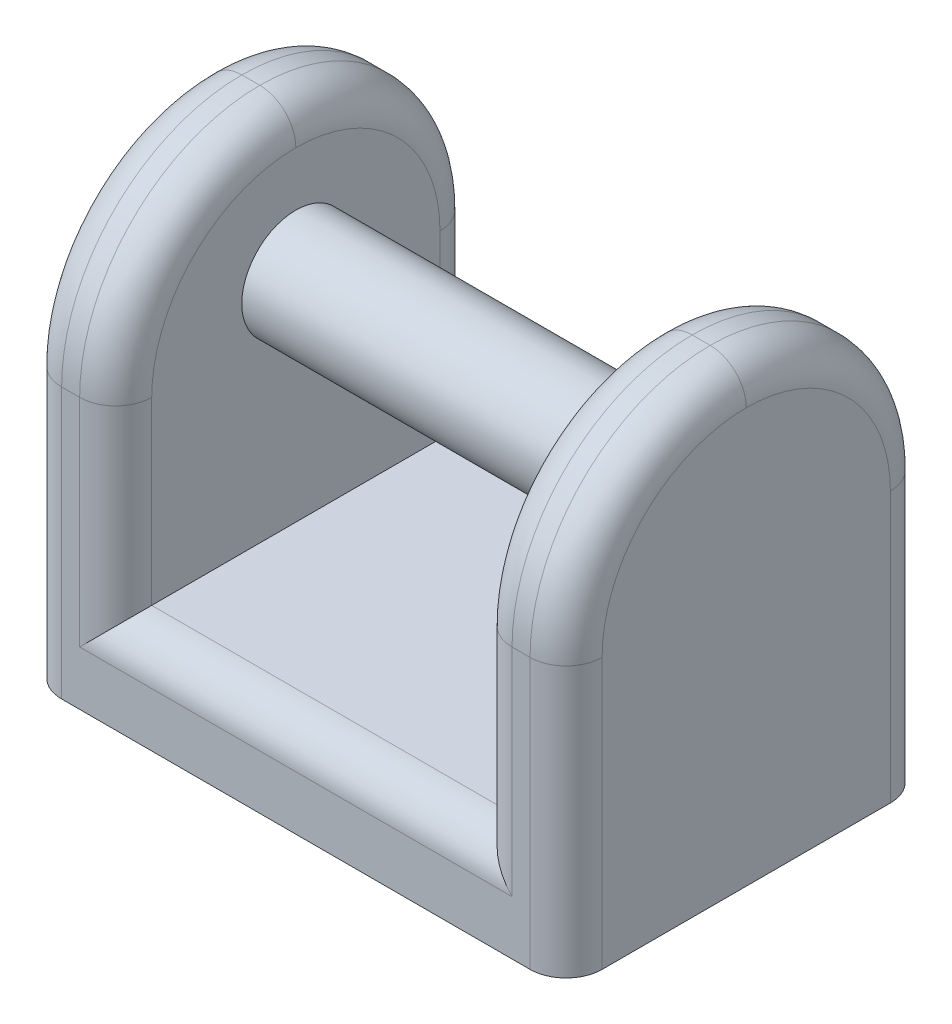
ISO-10303-21;
HEADER;
FILE_DESCRIPTION(('STEP AP214'),'2;1');
FILE_NAME('part.step','',(''),(''),'','','');
FILE_SCHEMA(('AUTOMOTIVE_DESIGN { 1 0 10303 214 1 1 1 1 }'));
ENDSEC;
DATA;
#1=APPLICATION_CONTEXT('core data for automotive mechanical design processes');
#2=APPLICATION_PROTOCOL_DEFINITION('international standard','automotive_design',2000,#1);
#3=PRODUCT_CONTEXT('',#1,'mechanical');
#4=PRODUCT('Part','Part','',(#3));
#5=PRODUCT_RELATED_PRODUCT_CATEGORY('part','',(#4));
#6=PRODUCT_DEFINITION_FORMATION('','',#4);
#7=PRODUCT_DEFINITION_CONTEXT('part definition',#1,'design');
#8=PRODUCT_DEFINITION('design','',#6,#7);
#9=PRODUCT_DEFINITION_SHAPE('','',#8);
#10=(LENGTH_UNIT() NAMED_UNIT(*) SI_UNIT(.MILLI.,.METRE.));
#11=(NAMED_UNIT(*) PLANE_ANGLE_UNIT() SI_UNIT($,.RADIAN.));
#12=(NAMED_UNIT(*) SI_UNIT($,.STERADIAN.) SOLID_ANGLE_UNIT());
#13=UNCERTAINTY_MEASURE_WITH_UNIT(LENGTH_MEASURE(1.E-05),#10,'distance_accuracy_value','');
#14=(GEOMETRIC_REPRESENTATION_CONTEXT(3) GLOBAL_UNCERTAINTY_ASSIGNED_CONTEXT((#13)) GLOBAL_UNIT_ASSIGNED_CONTEXT((#10,
#11,#12)) REPRESENTATION_CONTEXT('',''));
#15=CARTESIAN_POINT('',(0.,0.,0.));
#16=DIRECTION('',(0.,0.,1.));
#17=DIRECTION('',(1.,0.,0.));
#18=AXIS2_PLACEMENT_3D('',#15,#16,#17);
#19=CARTESIAN_POINT('',(75.,50.,50.));
#20=DIRECTION('',(1.,0.,0.));
#21=DIRECTION('',(0.,1.,0.));
#22=AXIS2_PLACEMENT_3D('',#19,#20,#21);
#23=PLANE('',#22);
#24=CARTESIAN_POINT('',(75.,25.,25.));
#25=DIRECTION('',(1.,0.,0.));
#26=DIRECTION('',(0.,1.,0.));
#27=AXIS2_PLACEMENT_3D('',#24,#25,#26);
#28=CIRCLE('',#27,20.);
#29=CARTESIAN_POINT('',(75.,45.,25.));
#30=VERTEX_POINT('',#29);
#31=CARTESIAN_POINT('',(75.,25.,45.));
#32=VERTEX_POINT('',#31);
#33=EDGE_CURVE('E284',#30,#32,#28,.T.);
#34=ORIENTED_EDGE('',*,*,#33,.T.);
#35=DIRECTION('',(0.,-1.,0.));
#36=VECTOR('',#35,1.);
#37=CARTESIAN_POINT('',(75.,-12.5,45.));
#38=LINE('',#37,#36);
#39=CARTESIAN_POINT('',(75.,-12.5,45.));
#40=VERTEX_POINT('',#39);
#41=EDGE_CURVE('E288',#32,#40,#38,.T.);
#42=ORIENTED_EDGE('',*,*,#41,.T.);
#43=DIRECTION('',(0.,0.,-1.));
#44=VECTOR('',#43,1.);
#45=CARTESIAN_POINT('',(75.,-12.5,50.));
#46=LINE('',#45,#44);
#47=CARTESIAN_POINT('',(75.,-12.5,5.));
#48=VERTEX_POINT('',#47);
#49=EDGE_CURVE('E411',#40,#48,#46,.T.);
#50=ORIENTED_EDGE('',*,*,#49,.T.);
#51=DIRECTION('',(0.,-1.,0.));
#52=VECTOR('',#51,1.);
#53=CARTESIAN_POINT('',(75.,50.,5.));
#54=LINE('',#53,#52);
#55=CARTESIAN_POINT('',(75.,25.,5.));
#56=VERTEX_POINT('',#55);
#57=EDGE_CURVE('E278',#48,#56,#54,.F.);
#58=ORIENTED_EDGE('',*,*,#57,.T.);
#59=CARTESIAN_POINT('',(75.,25.,25.));
#60=DIRECTION('',(1.,0.,0.));
#61=DIRECTION('',(0.,1.,0.));
#62=AXIS2_PLACEMENT_3D('',#59,#60,#61);
#63=CIRCLE('',#62,20.);
#64=EDGE_CURVE('E281',#56,#30,#63,.T.);
#65=ORIENTED_EDGE('',*,*,#64,.T.);
#66=EDGE_LOOP('',(#34,#42,#50,#58,#65));
#67=FACE_BOUND('',#66,.T.);
#68=ADVANCED_FACE('F41',(#67),#23,.T.);
#69=CARTESIAN_POINT('',(62.5,0.,50.));
#70=DIRECTION('',(-1.,0.,0.));
#71=DIRECTION('',(0.,0.,1.));
#72=AXIS2_PLACEMENT_3D('',#69,#70,#71);
#73=PLANE('',#72);
#74=CARTESIAN_POINT('',(62.5,30.,25.));
#75=DIRECTION('',(-1.,0.,0.));
#76=DIRECTION('',(0.,0.,1.));
#77=AXIS2_PLACEMENT_3D('',#74,#75,#76);
#78=CIRCLE('',#77,7.5);
#79=CARTESIAN_POINT('',(62.5,30.,32.5));
#80=VERTEX_POINT('',#79);
#81=EDGE_CURVE('E427',#80,#80,#78,.T.);
#82=ORIENTED_EDGE('',*,*,#81,.F.);
#83=EDGE_LOOP('',(#82));
#84=FACE_BOUND('',#83,.T.);
#85=DIRECTION('',(0.,0.,-1.));
#86=VECTOR('',#85,1.);
#87=CARTESIAN_POINT('',(62.5,0.,50.));
#88=LINE('',#87,#86);
#89=CARTESIAN_POINT('',(62.5,0.,45.));
#90=VERTEX_POINT('',#89);
#91=CARTESIAN_POINT('',(62.5,0.,5.));
#92=VERTEX_POINT('',#91);
#93=EDGE_CURVE('E183',#90,#92,#88,.T.);
#94=ORIENTED_EDGE('',*,*,#93,.F.);
#95=DIRECTION('',(0.,1.,0.));
#96=VECTOR('',#95,1.);
#97=CARTESIAN_POINT('',(62.5,25.,45.));
#98=LINE('',#97,#96);
#99=CARTESIAN_POINT('',(62.5,25.,45.));
#100=VERTEX_POINT('',#99);
#101=EDGE_CURVE('E199',#90,#100,#98,.T.);
#102=ORIENTED_EDGE('',*,*,#101,.T.);
#103=CARTESIAN_POINT('',(62.5,25.,25.));
#104=DIRECTION('',(-1.,0.,0.));
#105=DIRECTION('',(0.,0.,1.));
#106=AXIS2_PLACEMENT_3D('',#103,#104,#105);
#107=CIRCLE('',#106,20.);
#108=CARTESIAN_POINT('',(62.5,45.,25.));
#109=VERTEX_POINT('',#108);
#110=EDGE_CURVE('E222',#100,#109,#107,.T.);
#111=ORIENTED_EDGE('',*,*,#110,.T.);
#112=CARTESIAN_POINT('',(62.5,25.,25.));
#113=DIRECTION('',(-1.,0.,0.));
#114=DIRECTION('',(0.,0.,1.));
#115=AXIS2_PLACEMENT_3D('',#112,#113,#114);
#116=CIRCLE('',#115,20.);
#117=CARTESIAN_POINT('',(62.5,25.,5.));
#118=VERTEX_POINT('',#117);
#119=EDGE_CURVE('E228',#109,#118,#116,.T.);
#120=ORIENTED_EDGE('',*,*,#119,.T.);
#121=DIRECTION('',(0.,1.,0.));
#122=VECTOR('',#121,1.);
#123=CARTESIAN_POINT('',(62.5,0.,5.));
#124=LINE('',#123,#122);
#125=EDGE_CURVE('E202',#118,#92,#124,.F.);
#126=ORIENTED_EDGE('',*,*,#125,.T.);
#127=EDGE_LOOP('',(#94,#102,#111,#120,#126));
#128=FACE_BOUND('',#127,.T.);
#129=ADVANCED_FACE('F196',(#84,#128),#73,.T.);
#130=CARTESIAN_POINT('',(12.5,0.,50.));
#131=DIRECTION('',(0.,1.,0.));
#132=DIRECTION('',(0.,0.,1.));
#133=AXIS2_PLACEMENT_3D('',#130,#131,#132);
#134=PLANE('',#133);
#135=DIRECTION('',(0.,0.,-1.));
#136=VECTOR('',#135,1.);
#137=CARTESIAN_POINT('',(12.5,0.,50.));
#138=LINE('',#137,#136);
#139=CARTESIAN_POINT('',(12.5,0.,45.));
#140=VERTEX_POINT('',#139);
#141=CARTESIAN_POINT('',(12.5,0.,5.));
#142=VERTEX_POINT('',#141);
#143=EDGE_CURVE('E186',#140,#142,#138,.T.);
#144=ORIENTED_EDGE('',*,*,#143,.F.);
#145=DIRECTION('',(1.,0.,0.));
#146=VECTOR('',#145,1.);
#147=CARTESIAN_POINT('',(62.5,0.,45.));
#148=LINE('',#147,#146);
#149=EDGE_CURVE('E180',#140,#90,#148,.T.);
#150=ORIENTED_EDGE('',*,*,#149,.T.);
#151=ORIENTED_EDGE('',*,*,#93,.T.);
#152=DIRECTION('',(1.,0.,0.));
#153=VECTOR('',#152,1.);
#154=CARTESIAN_POINT('',(12.5,0.,5.));
#155=LINE('',#154,#153);
#156=EDGE_CURVE('E193',#92,#142,#155,.F.);
#157=ORIENTED_EDGE('',*,*,#156,.T.);
#158=EDGE_LOOP('',(#144,#150,#151,#157));
#159=FACE_BOUND('',#158,.T.);
#160=ADVANCED_FACE('F182',(#159),#134,.T.);
#161=CARTESIAN_POINT('',(12.5,50.,50.));
#162=DIRECTION('',(1.,0.,0.));
#163=DIRECTION('',(0.,0.,-1.));
#164=AXIS2_PLACEMENT_3D('',#161,#162,#163);
#165=PLANE('',#164);
#166=CARTESIAN_POINT('',(12.5,30.,25.));
#167=DIRECTION('',(1.,0.,0.));
#168=DIRECTION('',(0.,0.,-1.));
#169=AXIS2_PLACEMENT_3D('',#166,#167,#168);
#170=CIRCLE('',#169,7.5);
#171=CARTESIAN_POINT('',(12.5,30.,17.5));
#172=VERTEX_POINT('',#171);
#173=EDGE_CURVE('E204',#172,#172,#170,.T.);
#174=ORIENTED_EDGE('',*,*,#173,.F.);
#175=EDGE_LOOP('',(#174));
#176=FACE_BOUND('',#175,.T.);
#177=CARTESIAN_POINT('',(12.5,25.,25.));
#178=DIRECTION('',(1.,0.,0.));
#179=DIRECTION('',(0.,0.,-1.));
#180=AXIS2_PLACEMENT_3D('',#177,#178,#179);
#181=CIRCLE('',#180,20.);
#182=CARTESIAN_POINT('',(12.5,45.,25.));
#183=VERTEX_POINT('',#182);
#184=CARTESIAN_POINT('',(12.5,25.,45.));
#185=VERTEX_POINT('',#184);
#186=EDGE_CURVE('E247',#183,#185,#181,.T.);
#187=ORIENTED_EDGE('',*,*,#186,.T.);
#188=DIRECTION('',(0.,-1.,0.));
#189=VECTOR('',#188,1.);
#190=CARTESIAN_POINT('',(12.5,0.,45.));
#191=LINE('',#190,#189);
#192=EDGE_CURVE('E250',#185,#140,#191,.T.);
#193=ORIENTED_EDGE('',*,*,#192,.T.);
#194=ORIENTED_EDGE('',*,*,#143,.T.);
#195=DIRECTION('',(0.,-1.,0.));
#196=VECTOR('',#195,1.);
#197=CARTESIAN_POINT('',(12.5,50.,5.));
#198=LINE('',#197,#196);
#199=CARTESIAN_POINT('',(12.5,25.,5.));
#200=VERTEX_POINT('',#199);
#201=EDGE_CURVE('E241',#142,#200,#198,.F.);
#202=ORIENTED_EDGE('',*,*,#201,.T.);
#203=CARTESIAN_POINT('',(12.5,25.,25.));
#204=DIRECTION('',(1.,0.,0.));
#205=DIRECTION('',(0.,0.,-1.));
#206=AXIS2_PLACEMENT_3D('',#203,#204,#205);
#207=CIRCLE('',#206,20.);
#208=EDGE_CURVE('E244',#200,#183,#207,.T.);
#209=ORIENTED_EDGE('',*,*,#208,.T.);
#210=EDGE_LOOP('',(#187,#193,#194,#202,#209));
#211=FACE_BOUND('',#210,.T.);
#212=ADVANCED_FACE('F511',(#176,#211),#165,.T.);
#213=CARTESIAN_POINT('',(0.,0.,50.));
#214=DIRECTION('',(-1.,0.,0.));
#215=DIRECTION('',(0.,0.,1.));
#216=AXIS2_PLACEMENT_3D('',#213,#214,#215);
#217=PLANE('',#216);
#218=DIRECTION('',(0.,0.,-1.));
#219=VECTOR('',#218,1.);
#220=CARTESIAN_POINT('',(0.,-12.5,50.));
#221=LINE('',#220,#219);
#222=CARTESIAN_POINT('',(0.,-12.5,45.));
#223=VERTEX_POINT('',#222);
#224=CARTESIAN_POINT('',(0.,-12.5,5.));
#225=VERTEX_POINT('',#224);
#226=EDGE_CURVE('E419',#223,#225,#221,.T.);
#227=ORIENTED_EDGE('',*,*,#226,.F.);
#228=DIRECTION('',(0.,1.,0.));
#229=VECTOR('',#228,1.);
#230=CARTESIAN_POINT('',(0.,25.,45.));
#231=LINE('',#230,#229);
#232=CARTESIAN_POINT('',(0.,25.,45.));
#233=VERTEX_POINT('',#232);
#234=EDGE_CURVE('E275',#223,#233,#231,.T.);
#235=ORIENTED_EDGE('',*,*,#234,.T.);
#236=CARTESIAN_POINT('',(0.,25.,25.));
#237=DIRECTION('',(-1.,0.,0.));
#238=DIRECTION('',(0.,0.,1.));
#239=AXIS2_PLACEMENT_3D('',#236,#237,#238);
#240=CIRCLE('',#239,20.);
#241=CARTESIAN_POINT('',(0.,45.,25.));
#242=VERTEX_POINT('',#241);
#243=EDGE_CURVE('E271',#233,#242,#240,.T.);
#244=ORIENTED_EDGE('',*,*,#243,.T.);
#245=CARTESIAN_POINT('',(0.,25.,25.));
#246=DIRECTION('',(-1.,0.,0.));
#247=DIRECTION('',(0.,0.,1.));
#248=AXIS2_PLACEMENT_3D('',#245,#246,#247);
#249=CIRCLE('',#248,20.);
#250=CARTESIAN_POINT('',(0.,25.,5.));
#251=VERTEX_POINT('',#250);
#252=EDGE_CURVE('E268',#242,#251,#249,.T.);
#253=ORIENTED_EDGE('',*,*,#252,.T.);
#254=DIRECTION('',(0.,1.,0.));
#255=VECTOR('',#254,1.);
#256=CARTESIAN_POINT('',(0.,0.,5.));
#257=LINE('',#256,#255);
#258=EDGE_CURVE('E265',#251,#225,#257,.F.);
#259=ORIENTED_EDGE('',*,*,#258,.T.);
#260=EDGE_LOOP('',(#227,#235,#244,#253,#259));
#261=FACE_BOUND('',#260,.T.);
#262=ADVANCED_FACE('F488',(#261),#217,.T.);
#263=CARTESIAN_POINT('',(75.,-12.5,50.));
#264=DIRECTION('',(0.,-1.,0.));
#265=DIRECTION('',(0.,0.,-1.));
#266=AXIS2_PLACEMENT_3D('',#263,#264,#265);
#267=PLANE('',#266);
#268=ORIENTED_EDGE('',*,*,#49,.F.);
#269=CARTESIAN_POINT('',(70.,-12.5,45.));
#270=DIRECTION('',(0.,-1.,0.));
#271=DIRECTION('',(0.,0.,-1.));
#272=AXIS2_PLACEMENT_3D('',#269,#270,#271);
#273=CIRCLE('',#272,5.);
#274=CARTESIAN_POINT('',(70.,-12.5,50.));
#275=VERTEX_POINT('',#274);
#276=EDGE_CURVE('E315',#40,#275,#273,.T.);
#277=ORIENTED_EDGE('',*,*,#276,.T.);
#278=DIRECTION('',(-1.,0.,0.));
#279=VECTOR('',#278,1.);
#280=CARTESIAN_POINT('',(75.,-12.5,50.));
#281=LINE('',#280,#279);
#282=CARTESIAN_POINT('',(5.,-12.5,50.));
#283=VERTEX_POINT('',#282);
#284=EDGE_CURVE('E405',#275,#283,#281,.T.);
#285=ORIENTED_EDGE('',*,*,#284,.T.);
#286=CARTESIAN_POINT('',(5.,-12.5,45.));
#287=DIRECTION('',(0.,-1.,0.));
#288=DIRECTION('',(0.,0.,-1.));
#289=AXIS2_PLACEMENT_3D('',#286,#287,#288);
#290=CIRCLE('',#289,5.);
#291=EDGE_CURVE('E312',#283,#223,#290,.T.);
#292=ORIENTED_EDGE('',*,*,#291,.T.);
#293=ORIENTED_EDGE('',*,*,#226,.T.);
#294=CARTESIAN_POINT('',(5.,-12.5,5.));
#295=DIRECTION('',(0.,-1.,0.));
#296=DIRECTION('',(0.,0.,-1.));
#297=AXIS2_PLACEMENT_3D('',#294,#295,#296);
#298=CIRCLE('',#297,5.);
#299=CARTESIAN_POINT('',(5.,-12.5,0.));
#300=VERTEX_POINT('',#299);
#301=EDGE_CURVE('E309',#225,#300,#298,.T.);
#302=ORIENTED_EDGE('',*,*,#301,.T.);
#303=DIRECTION('',(-1.,0.,0.));
#304=VECTOR('',#303,1.);
#305=CARTESIAN_POINT('',(75.,-12.5,0.));
#306=LINE('',#305,#304);
#307=CARTESIAN_POINT('',(70.,-12.5,0.));
#308=VERTEX_POINT('',#307);
#309=EDGE_CURVE('E394',#308,#300,#306,.T.);
#310=ORIENTED_EDGE('',*,*,#309,.F.);
#311=CARTESIAN_POINT('',(70.,-12.5,5.));
#312=DIRECTION('',(0.,-1.,0.));
#313=DIRECTION('',(0.,0.,-1.));
#314=AXIS2_PLACEMENT_3D('',#311,#312,#313);
#315=CIRCLE('',#314,5.);
#316=EDGE_CURVE('E306',#308,#48,#315,.T.);
#317=ORIENTED_EDGE('',*,*,#316,.T.);
#318=EDGE_LOOP('',(#268,#277,#285,#292,#293,#302,#310,#317));
#319=FACE_BOUND('',#318,.T.);
#320=ADVANCED_FACE('F400',(#319),#267,.T.);
#321=CARTESIAN_POINT('',(0.,0.,50.));
#322=DIRECTION('',(0.,0.,-1.));
#323=DIRECTION('',(-1.,0.,0.));
#324=AXIS2_PLACEMENT_3D('',#321,#322,#323);
#325=PLANE('',#324);
#326=ORIENTED_EDGE('',*,*,#284,.F.);
#327=DIRECTION('',(0.,-1.,0.));
#328=VECTOR('',#327,1.);
#329=CARTESIAN_POINT('',(70.,25.,50.));
#330=LINE('',#329,#328);
#331=CARTESIAN_POINT('',(70.,25.,50.));
#332=VERTEX_POINT('',#331);
#333=EDGE_CURVE('E303',#275,#332,#330,.F.);
#334=ORIENTED_EDGE('',*,*,#333,.T.);
#335=DIRECTION('',(1.,0.,0.));
#336=VECTOR('',#335,1.);
#337=CARTESIAN_POINT('',(62.5,25.,50.));
#338=LINE('',#337,#336);
#339=CARTESIAN_POINT('',(67.5,25.,50.));
#340=VERTEX_POINT('',#339);
#341=EDGE_CURVE('E430',#332,#340,#338,.F.);
#342=ORIENTED_EDGE('',*,*,#341,.T.);
#343=DIRECTION('',(0.,1.,0.));
#344=VECTOR('',#343,1.);
#345=CARTESIAN_POINT('',(67.5,0.,50.));
#346=LINE('',#345,#344);
#347=CARTESIAN_POINT('',(67.5,-5.,50.));
#348=VERTEX_POINT('',#347);
#349=EDGE_CURVE('E300',#340,#348,#346,.F.);
#350=ORIENTED_EDGE('',*,*,#349,.T.);
#351=DIRECTION('',(1.,0.,0.));
#352=VECTOR('',#351,1.);
#353=CARTESIAN_POINT('',(12.5,-5.,50.));
#354=LINE('',#353,#352);
#355=CARTESIAN_POINT('',(7.5,-5.,50.));
#356=VERTEX_POINT('',#355);
#357=EDGE_CURVE('E210',#348,#356,#354,.F.);
#358=ORIENTED_EDGE('',*,*,#357,.T.);
#359=DIRECTION('',(0.,-1.,0.));
#360=VECTOR('',#359,1.);
#361=CARTESIAN_POINT('',(7.5,25.,50.));
#362=LINE('',#361,#360);
#363=CARTESIAN_POINT('',(7.5,25.,50.));
#364=VERTEX_POINT('',#363);
#365=EDGE_CURVE('E295',#356,#364,#362,.F.);
#366=ORIENTED_EDGE('',*,*,#365,.T.);
#367=DIRECTION('',(1.,0.,0.));
#368=VECTOR('',#367,1.);
#369=CARTESIAN_POINT('',(0.,25.,50.));
#370=LINE('',#369,#368);
#371=CARTESIAN_POINT('',(5.,25.,50.));
#372=VERTEX_POINT('',#371);
#373=EDGE_CURVE('E434',#364,#372,#370,.F.);
#374=ORIENTED_EDGE('',*,*,#373,.T.);
#375=DIRECTION('',(0.,1.,0.));
#376=VECTOR('',#375,1.);
#377=CARTESIAN_POINT('',(5.,-12.5,50.));
#378=LINE('',#377,#376);
#379=EDGE_CURVE('E192',#372,#283,#378,.F.);
#380=ORIENTED_EDGE('',*,*,#379,.T.);
#381=EDGE_LOOP('',(#326,#334,#342,#350,#358,#366,#374,#380));
#382=FACE_BOUND('',#381,.T.);
#383=ADVANCED_FACE('F463',(#382),#325,.F.);
#384=CARTESIAN_POINT('',(0.,0.,0.));
#385=DIRECTION('',(0.,0.,-1.));
#386=DIRECTION('',(-1.,0.,0.));
#387=AXIS2_PLACEMENT_3D('',#384,#385,#386);
#388=PLANE('',#387);
#389=DIRECTION('',(1.,0.,0.));
#390=VECTOR('',#389,1.);
#391=CARTESIAN_POINT('',(0.,-5.,0.));
#392=LINE('',#391,#390);
#393=CARTESIAN_POINT('',(7.5,-5.,0.));
#394=VERTEX_POINT('',#393);
#395=CARTESIAN_POINT('',(67.5,-5.,0.));
#396=VERTEX_POINT('',#395);
#397=EDGE_CURVE('E51',#394,#396,#392,.T.);
#398=ORIENTED_EDGE('',*,*,#397,.T.);
#399=DIRECTION('',(0.,1.,0.));
#400=VECTOR('',#399,1.);
#401=CARTESIAN_POINT('',(67.5,0.,0.));
#402=LINE('',#401,#400);
#403=CARTESIAN_POINT('',(67.5,25.,0.));
#404=VERTEX_POINT('',#403);
#405=EDGE_CURVE('E11',#396,#404,#402,.T.);
#406=ORIENTED_EDGE('',*,*,#405,.T.);
#407=DIRECTION('',(1.,0.,0.));
#408=VECTOR('',#407,1.);
#409=CARTESIAN_POINT('',(0.,25.,0.));
#410=LINE('',#409,#408);
#411=CARTESIAN_POINT('',(70.,25.,0.));
#412=VERTEX_POINT('',#411);
#413=EDGE_CURVE('E397',#404,#412,#410,.T.);
#414=ORIENTED_EDGE('',*,*,#413,.T.);
#415=DIRECTION('',(0.,-1.,0.));
#416=VECTOR('',#415,1.);
#417=CARTESIAN_POINT('',(70.,0.,0.));
#418=LINE('',#417,#416);
#419=EDGE_CURVE('E318',#412,#308,#418,.T.);
#420=ORIENTED_EDGE('',*,*,#419,.T.);
#421=ORIENTED_EDGE('',*,*,#309,.T.);
#422=DIRECTION('',(0.,1.,0.));
#423=VECTOR('',#422,1.);
#424=CARTESIAN_POINT('',(5.,0.,0.));
#425=LINE('',#424,#423);
#426=CARTESIAN_POINT('',(5.,25.,0.));
#427=VERTEX_POINT('',#426);
#428=EDGE_CURVE('E321',#300,#427,#425,.T.);
#429=ORIENTED_EDGE('',*,*,#428,.T.);
#430=DIRECTION('',(1.,0.,0.));
#431=VECTOR('',#430,1.);
#432=CARTESIAN_POINT('',(0.,25.,0.));
#433=LINE('',#432,#431);
#434=CARTESIAN_POINT('',(7.5,25.,0.));
#435=VERTEX_POINT('',#434);
#436=EDGE_CURVE('E426',#427,#435,#433,.T.);
#437=ORIENTED_EDGE('',*,*,#436,.T.);
#438=DIRECTION('',(0.,-1.,0.));
#439=VECTOR('',#438,1.);
#440=CARTESIAN_POINT('',(7.5,0.,0.));
#441=LINE('',#440,#439);
#442=EDGE_CURVE('E62',#435,#394,#441,.T.);
#443=ORIENTED_EDGE('',*,*,#442,.T.);
#444=EDGE_LOOP('',(#398,#406,#414,#420,#421,#429,#437,#443));
#445=FACE_BOUND('',#444,.T.);
#446=ADVANCED_FACE('F393',(#445),#388,.T.);
#447=CARTESIAN_POINT('',(0.,30.,25.));
#448=DIRECTION('',(1.,0.,0.));
#449=DIRECTION('',(0.,1.,0.));
#450=AXIS2_PLACEMENT_3D('',#447,#448,#449);
#451=CYLINDRICAL_SURFACE('',#450,7.5);
#452=ORIENTED_EDGE('',*,*,#81,.T.);
#453=EDGE_LOOP('',(#452));
#454=FACE_BOUND('',#453,.T.);
#455=ORIENTED_EDGE('',*,*,#173,.T.);
#456=EDGE_LOOP('',(#455));
#457=FACE_BOUND('',#456,.T.);
#458=ADVANCED_FACE('F542',(#454,#457),#451,.T.);
#459=CARTESIAN_POINT('',(0.,25.,25.));
#460=DIRECTION('',(-1.,0.,0.));
#461=DIRECTION('',(0.,0.,1.));
#462=AXIS2_PLACEMENT_3D('',#459,#460,#461);
#463=CYLINDRICAL_SURFACE('',#462,25.);
#464=ORIENTED_EDGE('',*,*,#373,.F.);
#465=CARTESIAN_POINT('',(7.5,25.,25.));
#466=DIRECTION('',(1.,0.,0.));
#467=DIRECTION('',(0.,0.,-1.));
#468=AXIS2_PLACEMENT_3D('',#465,#466,#467);
#469=CIRCLE('',#468,25.);
#470=CARTESIAN_POINT('',(7.5,50.,25.));
#471=VERTEX_POINT('',#470);
#472=EDGE_CURVE('E256',#364,#471,#469,.F.);
#473=ORIENTED_EDGE('',*,*,#472,.T.);
#474=DIRECTION('',(1.,0.,0.));
#475=VECTOR('',#474,1.);
#476=CARTESIAN_POINT('',(12.5,50.,25.));
#477=LINE('',#476,#475);
#478=CARTESIAN_POINT('',(5.,50.,25.));
#479=VERTEX_POINT('',#478);
#480=EDGE_CURVE('E406',#479,#471,#477,.T.);
#481=ORIENTED_EDGE('',*,*,#480,.F.);
#482=CARTESIAN_POINT('',(5.,25.,25.));
#483=DIRECTION('',(-1.,0.,0.));
#484=DIRECTION('',(0.,0.,1.));
#485=AXIS2_PLACEMENT_3D('',#482,#483,#484);
#486=CIRCLE('',#485,25.);
#487=EDGE_CURVE('E253',#479,#372,#486,.F.);
#488=ORIENTED_EDGE('',*,*,#487,.T.);
#489=EDGE_LOOP('',(#464,#473,#481,#488));
#490=FACE_BOUND('',#489,.T.);
#491=ADVANCED_FACE('F539',(#490),#463,.T.);
#492=CARTESIAN_POINT('',(0.,25.,25.));
#493=DIRECTION('',(1.,0.,0.));
#494=DIRECTION('',(0.,0.,-1.));
#495=AXIS2_PLACEMENT_3D('',#492,#493,#494);
#496=CYLINDRICAL_SURFACE('',#495,25.);
#497=ORIENTED_EDGE('',*,*,#480,.T.);
#498=CARTESIAN_POINT('',(7.5,25.,25.));
#499=DIRECTION('',(1.,0.,0.));
#500=DIRECTION('',(0.,0.,-1.));
#501=AXIS2_PLACEMENT_3D('',#498,#499,#500);
#502=CIRCLE('',#501,25.);
#503=EDGE_CURVE('E262',#471,#435,#502,.F.);
#504=ORIENTED_EDGE('',*,*,#503,.T.);
#505=ORIENTED_EDGE('',*,*,#436,.F.);
#506=CARTESIAN_POINT('',(5.,25.,25.));
#507=DIRECTION('',(-1.,0.,0.));
#508=DIRECTION('',(0.,0.,1.));
#509=AXIS2_PLACEMENT_3D('',#506,#507,#508);
#510=CIRCLE('',#509,25.);
#511=EDGE_CURVE('E259',#427,#479,#510,.F.);
#512=ORIENTED_EDGE('',*,*,#511,.T.);
#513=EDGE_LOOP('',(#497,#504,#505,#512));
#514=FACE_BOUND('',#513,.T.);
#515=ADVANCED_FACE('F497',(#514),#496,.T.);
#516=CARTESIAN_POINT('',(0.,25.,25.));
#517=DIRECTION('',(1.,0.,0.));
#518=DIRECTION('',(0.,0.,-1.));
#519=AXIS2_PLACEMENT_3D('',#516,#517,#518);
#520=CYLINDRICAL_SURFACE('',#519,25.);
#521=ORIENTED_EDGE('',*,*,#413,.F.);
#522=CARTESIAN_POINT('',(67.5,25.,25.));
#523=DIRECTION('',(-1.,0.,0.));
#524=DIRECTION('',(0.,0.,1.));
#525=AXIS2_PLACEMENT_3D('',#522,#523,#524);
#526=CIRCLE('',#525,25.);
#527=CARTESIAN_POINT('',(67.5,50.,25.));
#528=VERTEX_POINT('',#527);
#529=EDGE_CURVE('E238',#404,#528,#526,.F.);
#530=ORIENTED_EDGE('',*,*,#529,.T.);
#531=DIRECTION('',(1.,0.,0.));
#532=VECTOR('',#531,1.);
#533=CARTESIAN_POINT('',(62.5,50.,25.));
#534=LINE('',#533,#532);
#535=CARTESIAN_POINT('',(70.,50.,25.));
#536=VERTEX_POINT('',#535);
#537=EDGE_CURVE('E359',#536,#528,#534,.F.);
#538=ORIENTED_EDGE('',*,*,#537,.F.);
#539=CARTESIAN_POINT('',(70.,25.,25.));
#540=DIRECTION('',(1.,0.,0.));
#541=DIRECTION('',(0.,1.,0.));
#542=AXIS2_PLACEMENT_3D('',#539,#540,#541);
#543=CIRCLE('',#542,25.);
#544=EDGE_CURVE('E235',#536,#412,#543,.F.);
#545=ORIENTED_EDGE('',*,*,#544,.T.);
#546=EDGE_LOOP('',(#521,#530,#538,#545));
#547=FACE_BOUND('',#546,.T.);
#548=ADVANCED_FACE('F454',(#547),#520,.T.);
#549=CARTESIAN_POINT('',(62.5,25.,25.));
#550=DIRECTION('',(-1.,0.,0.));
#551=DIRECTION('',(0.,0.,1.));
#552=AXIS2_PLACEMENT_3D('',#549,#550,#551);
#553=CYLINDRICAL_SURFACE('',#552,25.);
#554=ORIENTED_EDGE('',*,*,#537,.T.);
#555=CARTESIAN_POINT('',(67.5,25.,25.));
#556=DIRECTION('',(-1.,0.,0.));
#557=DIRECTION('',(0.,0.,1.));
#558=AXIS2_PLACEMENT_3D('',#555,#556,#557);
#559=CIRCLE('',#558,25.);
#560=EDGE_CURVE('E226',#528,#340,#559,.F.);
#561=ORIENTED_EDGE('',*,*,#560,.T.);
#562=ORIENTED_EDGE('',*,*,#341,.F.);
#563=CARTESIAN_POINT('',(70.,25.,25.));
#564=DIRECTION('',(1.,0.,0.));
#565=DIRECTION('',(0.,1.,0.));
#566=AXIS2_PLACEMENT_3D('',#563,#564,#565);
#567=CIRCLE('',#566,25.);
#568=EDGE_CURVE('E221',#332,#536,#567,.F.);
#569=ORIENTED_EDGE('',*,*,#568,.T.);
#570=EDGE_LOOP('',(#554,#561,#562,#569));
#571=FACE_BOUND('',#570,.T.);
#572=ADVANCED_FACE('F457',(#571),#553,.T.);
#573=CARTESIAN_POINT('',(7.5,25.,25.));
#574=DIRECTION('',(1.,0.,0.));
#575=DIRECTION('',(0.,0.,-1.));
#576=AXIS2_PLACEMENT_3D('',#573,#574,#575);
#577=TOROIDAL_SURFACE('',#576,20.,5.);
#578=CARTESIAN_POINT('',(7.5,25.,5.));
#579=DIRECTION('',(0.,-1.,0.));
#580=DIRECTION('',(0.,0.,-1.));
#581=AXIS2_PLACEMENT_3D('',#578,#579,#580);
#582=CIRCLE('',#581,5.);
#583=EDGE_CURVE('E351',#435,#200,#582,.T.);
#584=ORIENTED_EDGE('',*,*,#583,.F.);
#585=ORIENTED_EDGE('',*,*,#503,.F.);
#586=CARTESIAN_POINT('',(7.5,45.,25.));
#587=DIRECTION('',(0.,0.,1.));
#588=DIRECTION('',(1.,0.,0.));
#589=AXIS2_PLACEMENT_3D('',#586,#587,#588);
#590=CIRCLE('',#589,5.);
#591=EDGE_CURVE('E355',#183,#471,#590,.T.);
#592=ORIENTED_EDGE('',*,*,#591,.F.);
#593=ORIENTED_EDGE('',*,*,#208,.F.);
#594=EDGE_LOOP('',(#584,#585,#592,#593));
#595=FACE_BOUND('',#594,.T.);
#596=ADVANCED_FACE('F502',(#595),#577,.T.);
#597=CARTESIAN_POINT('',(7.5,25.,25.));
#598=DIRECTION('',(1.,0.,0.));
#599=DIRECTION('',(0.,0.,-1.));
#600=AXIS2_PLACEMENT_3D('',#597,#598,#599);
#601=TOROIDAL_SURFACE('',#600,20.,5.);
#602=ORIENTED_EDGE('',*,*,#591,.T.);
#603=ORIENTED_EDGE('',*,*,#472,.F.);
#604=CARTESIAN_POINT('',(7.5,25.,45.));
#605=DIRECTION('',(0.,-1.,0.));
#606=DIRECTION('',(0.,0.,-1.));
#607=AXIS2_PLACEMENT_3D('',#604,#605,#606);
#608=CIRCLE('',#607,5.);
#609=EDGE_CURVE('E347',#185,#364,#608,.T.);
#610=ORIENTED_EDGE('',*,*,#609,.F.);
#611=ORIENTED_EDGE('',*,*,#186,.F.);
#612=EDGE_LOOP('',(#602,#603,#610,#611));
#613=FACE_BOUND('',#612,.T.);
#614=ADVANCED_FACE('F507',(#613),#601,.T.);
#615=CARTESIAN_POINT('',(7.5,0.,5.));
#616=DIRECTION('',(0.,-1.,0.));
#617=DIRECTION('',(0.,0.,-1.));
#618=AXIS2_PLACEMENT_3D('',#615,#616,#617);
#619=CYLINDRICAL_SURFACE('',#618,5.);
#620=ORIENTED_EDGE('',*,*,#583,.T.);
#621=ORIENTED_EDGE('',*,*,#201,.F.);
#622=CARTESIAN_POINT('',(7.5,-5.,5.));
#623=DIRECTION('',(0.707106781186547,-0.707106781186547,0.));
#624=DIRECTION('',(0.707106781186547,0.707106781186547,0.));
#625=AXIS2_PLACEMENT_3D('',#622,#623,#624);
#626=ELLIPSE('',#625,7.07106781186547,5.);
#627=EDGE_CURVE('E343',#394,#142,#626,.T.);
#628=ORIENTED_EDGE('',*,*,#627,.F.);
#629=ORIENTED_EDGE('',*,*,#442,.F.);
#630=EDGE_LOOP('',(#620,#621,#628,#629));
#631=FACE_BOUND('',#630,.T.);
#632=ADVANCED_FACE('F514',(#631),#619,.T.);
#633=CARTESIAN_POINT('',(7.5,50.,45.));
#634=DIRECTION('',(0.,1.,0.));
#635=DIRECTION('',(0.,0.,1.));
#636=AXIS2_PLACEMENT_3D('',#633,#634,#635);
#637=CYLINDRICAL_SURFACE('',#636,5.);
#638=ORIENTED_EDGE('',*,*,#609,.T.);
#639=ORIENTED_EDGE('',*,*,#365,.F.);
#640=CARTESIAN_POINT('',(7.5,-5.,45.));
#641=DIRECTION('',(-0.707106781186547,0.707106781186547,0.));
#642=DIRECTION('',(-0.707106781186547,-0.707106781186547,0.));
#643=AXIS2_PLACEMENT_3D('',#640,#641,#642);
#644=ELLIPSE('',#643,7.07106781186547,5.);
#645=EDGE_CURVE('E340',#140,#356,#644,.F.);
#646=ORIENTED_EDGE('',*,*,#645,.F.);
#647=ORIENTED_EDGE('',*,*,#192,.F.);
#648=EDGE_LOOP('',(#638,#639,#646,#647));
#649=FACE_BOUND('',#648,.T.);
#650=ADVANCED_FACE('F518',(#649),#637,.T.);
#651=CARTESIAN_POINT('',(0.,-5.,5.));
#652=DIRECTION('',(1.,0.,0.));
#653=DIRECTION('',(0.,0.,-1.));
#654=AXIS2_PLACEMENT_3D('',#651,#652,#653);
#655=CYLINDRICAL_SURFACE('',#654,5.);
#656=ORIENTED_EDGE('',*,*,#627,.T.);
#657=ORIENTED_EDGE('',*,*,#156,.F.);
#658=CARTESIAN_POINT('',(67.5,-5.,5.));
#659=DIRECTION('',(0.707106781186547,0.707106781186547,0.));
#660=DIRECTION('',(0.707106781186547,-0.707106781186547,0.));
#661=AXIS2_PLACEMENT_3D('',#658,#659,#660);
#662=ELLIPSE('',#661,7.07106781186547,5.);
#663=EDGE_CURVE('E214',#396,#92,#662,.T.);
#664=ORIENTED_EDGE('',*,*,#663,.F.);
#665=ORIENTED_EDGE('',*,*,#397,.F.);
#666=EDGE_LOOP('',(#656,#657,#664,#665));
#667=FACE_BOUND('',#666,.T.);
#668=ADVANCED_FACE('F516',(#667),#655,.T.);
#669=CARTESIAN_POINT('',(12.5,-5.,45.));
#670=DIRECTION('',(-1.,0.,0.));
#671=DIRECTION('',(0.,0.,1.));
#672=AXIS2_PLACEMENT_3D('',#669,#670,#671);
#673=CYLINDRICAL_SURFACE('',#672,5.);
#674=ORIENTED_EDGE('',*,*,#645,.T.);
#675=ORIENTED_EDGE('',*,*,#357,.F.);
#676=CARTESIAN_POINT('',(67.5,-5.,45.));
#677=DIRECTION('',(-0.707106781186547,-0.707106781186547,0.));
#678=DIRECTION('',(-0.707106781186547,0.707106781186547,0.));
#679=AXIS2_PLACEMENT_3D('',#676,#677,#678);
#680=ELLIPSE('',#679,7.07106781186547,5.);
#681=EDGE_CURVE('E208',#90,#348,#680,.F.);
#682=ORIENTED_EDGE('',*,*,#681,.F.);
#683=ORIENTED_EDGE('',*,*,#149,.F.);
#684=EDGE_LOOP('',(#674,#675,#682,#683));
#685=FACE_BOUND('',#684,.T.);
#686=ADVANCED_FACE('F209',(#685),#673,.T.);
#687=CARTESIAN_POINT('',(67.5,0.,5.));
#688=DIRECTION('',(0.,1.,0.));
#689=DIRECTION('',(0.,0.,1.));
#690=AXIS2_PLACEMENT_3D('',#687,#688,#689);
#691=CYLINDRICAL_SURFACE('',#690,5.);
#692=ORIENTED_EDGE('',*,*,#663,.T.);
#693=ORIENTED_EDGE('',*,*,#125,.F.);
#694=CARTESIAN_POINT('',(67.5,25.,5.));
#695=DIRECTION('',(0.,1.,0.));
#696=DIRECTION('',(0.,0.,1.));
#697=AXIS2_PLACEMENT_3D('',#694,#695,#696);
#698=CIRCLE('',#697,5.);
#699=EDGE_CURVE('E215',#404,#118,#698,.T.);
#700=ORIENTED_EDGE('',*,*,#699,.F.);
#701=ORIENTED_EDGE('',*,*,#405,.F.);
#702=EDGE_LOOP('',(#692,#693,#700,#701));
#703=FACE_BOUND('',#702,.T.);
#704=ADVANCED_FACE('F448',(#703),#691,.T.);
#705=CARTESIAN_POINT('',(67.5,0.,45.));
#706=DIRECTION('',(0.,-1.,0.));
#707=DIRECTION('',(0.,0.,-1.));
#708=AXIS2_PLACEMENT_3D('',#705,#706,#707);
#709=CYLINDRICAL_SURFACE('',#708,5.);
#710=ORIENTED_EDGE('',*,*,#681,.T.);
#711=ORIENTED_EDGE('',*,*,#349,.F.);
#712=CARTESIAN_POINT('',(67.5,25.,45.));
#713=DIRECTION('',(0.,1.,0.));
#714=DIRECTION('',(0.,0.,1.));
#715=AXIS2_PLACEMENT_3D('',#712,#713,#714);
#716=CIRCLE('',#715,5.);
#717=EDGE_CURVE('E218',#100,#340,#716,.T.);
#718=ORIENTED_EDGE('',*,*,#717,.F.);
#719=ORIENTED_EDGE('',*,*,#101,.F.);
#720=EDGE_LOOP('',(#710,#711,#718,#719));
#721=FACE_BOUND('',#720,.T.);
#722=ADVANCED_FACE('F217',(#721),#709,.T.);
#723=CARTESIAN_POINT('',(67.5,25.,25.));
#724=DIRECTION('',(-1.,0.,0.));
#725=DIRECTION('',(0.,0.,1.));
#726=AXIS2_PLACEMENT_3D('',#723,#724,#725);
#727=TOROIDAL_SURFACE('',#726,20.,5.);
#728=ORIENTED_EDGE('',*,*,#699,.T.);
#729=ORIENTED_EDGE('',*,*,#119,.F.);
#730=CARTESIAN_POINT('',(67.5,45.,25.));
#731=DIRECTION('',(0.,0.,1.));
#732=DIRECTION('',(1.,0.,0.));
#733=AXIS2_PLACEMENT_3D('',#730,#731,#732);
#734=CIRCLE('',#733,5.);
#735=EDGE_CURVE('E328',#528,#109,#734,.T.);
#736=ORIENTED_EDGE('',*,*,#735,.F.);
#737=ORIENTED_EDGE('',*,*,#529,.F.);
#738=EDGE_LOOP('',(#728,#729,#736,#737));
#739=FACE_BOUND('',#738,.T.);
#740=ADVANCED_FACE('F451',(#739),#727,.T.);
#741=CARTESIAN_POINT('',(67.5,25.,25.));
#742=DIRECTION('',(-1.,0.,0.));
#743=DIRECTION('',(0.,0.,1.));
#744=AXIS2_PLACEMENT_3D('',#741,#742,#743);
#745=TOROIDAL_SURFACE('',#744,20.,5.);
#746=ORIENTED_EDGE('',*,*,#717,.T.);
#747=ORIENTED_EDGE('',*,*,#560,.F.);
#748=ORIENTED_EDGE('',*,*,#735,.T.);
#749=ORIENTED_EDGE('',*,*,#110,.F.);
#750=EDGE_LOOP('',(#746,#747,#748,#749));
#751=FACE_BOUND('',#750,.T.);
#752=ADVANCED_FACE('F460',(#751),#745,.T.);
#753=CARTESIAN_POINT('',(5.,0.,5.));
#754=DIRECTION('',(0.,1.,0.));
#755=DIRECTION('',(0.,0.,1.));
#756=AXIS2_PLACEMENT_3D('',#753,#754,#755);
#757=CYLINDRICAL_SURFACE('',#756,5.);
#758=ORIENTED_EDGE('',*,*,#301,.F.);
#759=ORIENTED_EDGE('',*,*,#258,.F.);
#760=CARTESIAN_POINT('',(5.,25.,5.));
#761=DIRECTION('',(0.,1.,0.));
#762=DIRECTION('',(0.,0.,1.));
#763=AXIS2_PLACEMENT_3D('',#760,#761,#762);
#764=CIRCLE('',#763,5.);
#765=EDGE_CURVE('E331',#427,#251,#764,.T.);
#766=ORIENTED_EDGE('',*,*,#765,.F.);
#767=ORIENTED_EDGE('',*,*,#428,.F.);
#768=EDGE_LOOP('',(#758,#759,#766,#767));
#769=FACE_BOUND('',#768,.T.);
#770=ADVANCED_FACE('F491',(#769),#757,.T.);
#771=CARTESIAN_POINT('',(5.,0.,45.));
#772=DIRECTION('',(0.,-1.,0.));
#773=DIRECTION('',(0.,0.,-1.));
#774=AXIS2_PLACEMENT_3D('',#771,#772,#773);
#775=CYLINDRICAL_SURFACE('',#774,5.);
#776=ORIENTED_EDGE('',*,*,#291,.F.);
#777=ORIENTED_EDGE('',*,*,#379,.F.);
#778=CARTESIAN_POINT('',(5.,25.,45.));
#779=DIRECTION('',(0.,1.,0.));
#780=DIRECTION('',(0.,0.,1.));
#781=AXIS2_PLACEMENT_3D('',#778,#779,#780);
#782=CIRCLE('',#781,5.);
#783=EDGE_CURVE('E363',#233,#372,#782,.T.);
#784=ORIENTED_EDGE('',*,*,#783,.F.);
#785=ORIENTED_EDGE('',*,*,#234,.F.);
#786=EDGE_LOOP('',(#776,#777,#784,#785));
#787=FACE_BOUND('',#786,.T.);
#788=ADVANCED_FACE('F478',(#787),#775,.T.);
#789=CARTESIAN_POINT('',(5.,25.,25.));
#790=DIRECTION('',(-1.,0.,0.));
#791=DIRECTION('',(0.,0.,1.));
#792=AXIS2_PLACEMENT_3D('',#789,#790,#791);
#793=TOROIDAL_SURFACE('',#792,20.,5.);
#794=ORIENTED_EDGE('',*,*,#765,.T.);
#795=ORIENTED_EDGE('',*,*,#252,.F.);
#796=CARTESIAN_POINT('',(5.,45.,25.));
#797=DIRECTION('',(0.,0.,1.));
#798=DIRECTION('',(1.,0.,0.));
#799=AXIS2_PLACEMENT_3D('',#796,#797,#798);
#800=CIRCLE('',#799,5.);
#801=EDGE_CURVE('E360',#479,#242,#800,.T.);
#802=ORIENTED_EDGE('',*,*,#801,.F.);
#803=ORIENTED_EDGE('',*,*,#511,.F.);
#804=EDGE_LOOP('',(#794,#795,#802,#803));
#805=FACE_BOUND('',#804,.T.);
#806=ADVANCED_FACE('F586',(#805),#793,.T.);
#807=CARTESIAN_POINT('',(5.,25.,25.));
#808=DIRECTION('',(-1.,0.,0.));
#809=DIRECTION('',(0.,0.,1.));
#810=AXIS2_PLACEMENT_3D('',#807,#808,#809);
#811=TOROIDAL_SURFACE('',#810,20.,5.);
#812=ORIENTED_EDGE('',*,*,#783,.T.);
#813=ORIENTED_EDGE('',*,*,#487,.F.);
#814=ORIENTED_EDGE('',*,*,#801,.T.);
#815=ORIENTED_EDGE('',*,*,#243,.F.);
#816=EDGE_LOOP('',(#812,#813,#814,#815));
#817=FACE_BOUND('',#816,.T.);
#818=ADVANCED_FACE('F483',(#817),#811,.T.);
#819=CARTESIAN_POINT('',(70.,0.,5.));
#820=DIRECTION('',(0.,-1.,0.));
#821=DIRECTION('',(1.,0.,0.));
#822=AXIS2_PLACEMENT_3D('',#819,#820,#821);
#823=CYLINDRICAL_SURFACE('',#822,5.);
#824=ORIENTED_EDGE('',*,*,#316,.F.);
#825=ORIENTED_EDGE('',*,*,#419,.F.);
#826=CARTESIAN_POINT('',(70.,25.,5.));
#827=DIRECTION('',(0.,1.,0.));
#828=DIRECTION('',(0.,0.,1.));
#829=AXIS2_PLACEMENT_3D('',#826,#827,#828);
#830=CIRCLE('',#829,5.);
#831=EDGE_CURVE('E45',#56,#412,#830,.T.);
#832=ORIENTED_EDGE('',*,*,#831,.F.);
#833=ORIENTED_EDGE('',*,*,#57,.F.);
#834=EDGE_LOOP('',(#824,#825,#832,#833));
#835=FACE_BOUND('',#834,.T.);
#836=ADVANCED_FACE('F43',(#835),#823,.T.);
#837=CARTESIAN_POINT('',(70.,25.,25.));
#838=DIRECTION('',(1.,0.,0.));
#839=DIRECTION('',(0.,1.,0.));
#840=AXIS2_PLACEMENT_3D('',#837,#838,#839);
#841=TOROIDAL_SURFACE('',#840,20.,5.);
#842=ORIENTED_EDGE('',*,*,#831,.T.);
#843=ORIENTED_EDGE('',*,*,#544,.F.);
#844=CARTESIAN_POINT('',(70.,45.,25.));
#845=DIRECTION('',(0.,0.,1.));
#846=DIRECTION('',(1.,0.,0.));
#847=AXIS2_PLACEMENT_3D('',#844,#845,#846);
#848=CIRCLE('',#847,5.);
#849=EDGE_CURVE('E372',#30,#536,#848,.T.);
#850=ORIENTED_EDGE('',*,*,#849,.F.);
#851=ORIENTED_EDGE('',*,*,#64,.F.);
#852=EDGE_LOOP('',(#842,#843,#850,#851));
#853=FACE_BOUND('',#852,.T.);
#854=ADVANCED_FACE('F385',(#853),#841,.T.);
#855=CARTESIAN_POINT('',(70.,50.,45.));
#856=DIRECTION('',(0.,1.,0.));
#857=DIRECTION('',(-1.,0.,0.));
#858=AXIS2_PLACEMENT_3D('',#855,#856,#857);
#859=CYLINDRICAL_SURFACE('',#858,5.);
#860=ORIENTED_EDGE('',*,*,#276,.F.);
#861=ORIENTED_EDGE('',*,*,#41,.F.);
#862=CARTESIAN_POINT('',(70.,25.,45.));
#863=DIRECTION('',(0.,1.,0.));
#864=DIRECTION('',(0.,0.,1.));
#865=AXIS2_PLACEMENT_3D('',#862,#863,#864);
#866=CIRCLE('',#865,5.);
#867=EDGE_CURVE('E370',#332,#32,#866,.T.);
#868=ORIENTED_EDGE('',*,*,#867,.F.);
#869=ORIENTED_EDGE('',*,*,#333,.F.);
#870=EDGE_LOOP('',(#860,#861,#868,#869));
#871=FACE_BOUND('',#870,.T.);
#872=ADVANCED_FACE('F471',(#871),#859,.T.);
#873=CARTESIAN_POINT('',(70.,25.,25.));
#874=DIRECTION('',(1.,0.,0.));
#875=DIRECTION('',(0.,1.,0.));
#876=AXIS2_PLACEMENT_3D('',#873,#874,#875);
#877=TOROIDAL_SURFACE('',#876,20.,5.);
#878=ORIENTED_EDGE('',*,*,#849,.T.);
#879=ORIENTED_EDGE('',*,*,#568,.F.);
#880=ORIENTED_EDGE('',*,*,#867,.T.);
#881=ORIENTED_EDGE('',*,*,#33,.F.);
#882=EDGE_LOOP('',(#878,#879,#880,#881));
#883=FACE_BOUND('',#882,.T.);
#884=ADVANCED_FACE('F467',(#883),#877,.T.);
#885=CLOSED_SHELL('',(#68,#129,#160,#212,#262,#320,#383,#446,#458,#491,#515,#548,#572,#596,#614,
#632,#650,#668,#686,#704,#722,#740,#752,#770,#788,#806,#818,#836,#854,#872,#884));
#886=MANIFOLD_SOLID_BREP('B2',#885);
#887=ADVANCED_BREP_SHAPE_REPRESENTATION('',(#18,#886),#14);
#888=SHAPE_DEFINITION_REPRESENTATION(#9,#887);
ENDSEC;
END-ISO-10303-21;
